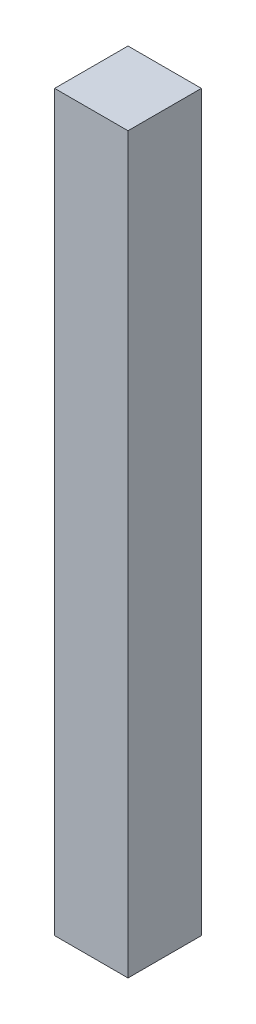
ISO-10303-21;
HEADER;
FILE_DESCRIPTION(('STEP AP214'),'2;1');
FILE_NAME('part.step','',(''),(''),'','','');
FILE_SCHEMA(('AUTOMOTIVE_DESIGN { 1 0 10303 214 1 1 1 1 }'));
ENDSEC;
DATA;
#1=APPLICATION_CONTEXT('core data for automotive mechanical design processes');
#2=APPLICATION_PROTOCOL_DEFINITION('international standard','automotive_design',2000,#1);
#3=PRODUCT_CONTEXT('',#1,'mechanical');
#4=PRODUCT('Part','Part','',(#3));
#5=PRODUCT_RELATED_PRODUCT_CATEGORY('part','',(#4));
#6=PRODUCT_DEFINITION_FORMATION('','',#4);
#7=PRODUCT_DEFINITION_CONTEXT('part definition',#1,'design');
#8=PRODUCT_DEFINITION('design','',#6,#7);
#9=PRODUCT_DEFINITION_SHAPE('','',#8);
#10=(LENGTH_UNIT() NAMED_UNIT(*) SI_UNIT(.MILLI.,.METRE.));
#11=(NAMED_UNIT(*) PLANE_ANGLE_UNIT() SI_UNIT($,.RADIAN.));
#12=(NAMED_UNIT(*) SI_UNIT($,.STERADIAN.) SOLID_ANGLE_UNIT());
#13=UNCERTAINTY_MEASURE_WITH_UNIT(LENGTH_MEASURE(1.E-05),#10,'distance_accuracy_value','');
#14=(GEOMETRIC_REPRESENTATION_CONTEXT(3) GLOBAL_UNCERTAINTY_ASSIGNED_CONTEXT((#13)) GLOBAL_UNIT_ASSIGNED_CONTEXT((#10,
#11,#12)) REPRESENTATION_CONTEXT('',''));
#15=CARTESIAN_POINT('',(0.,0.,0.));
#16=DIRECTION('',(0.,0.,1.));
#17=DIRECTION('',(1.,0.,0.));
#18=AXIS2_PLACEMENT_3D('',#15,#16,#17);
#19=CARTESIAN_POINT('',(0.,200.,0.));
#20=DIRECTION('',(1.,0.,0.));
#21=DIRECTION('',(0.,0.,-1.));
#22=AXIS2_PLACEMENT_3D('',#19,#20,#21);
#23=PLANE('',#22);
#24=DIRECTION('',(0.,0.,1.));
#25=VECTOR('',#24,1.);
#26=CARTESIAN_POINT('',(0.,0.,0.));
#27=LINE('',#26,#25);
#28=CARTESIAN_POINT('',(0.,0.,0.));
#29=VERTEX_POINT('',#28);
#30=CARTESIAN_POINT('',(0.,0.,20.));
#31=VERTEX_POINT('',#30);
#32=EDGE_CURVE('E98',#29,#31,#27,.T.);
#33=ORIENTED_EDGE('',*,*,#32,.T.);
#34=DIRECTION('',(0.,-1.,0.));
#35=VECTOR('',#34,1.);
#36=CARTESIAN_POINT('',(0.,200.,20.));
#37=LINE('',#36,#35);
#38=CARTESIAN_POINT('',(0.,200.,20.));
#39=VERTEX_POINT('',#38);
#40=EDGE_CURVE('E11',#39,#31,#37,.T.);
#41=ORIENTED_EDGE('',*,*,#40,.F.);
#42=DIRECTION('',(0.,0.,1.));
#43=VECTOR('',#42,1.);
#44=CARTESIAN_POINT('',(0.,200.,0.));
#45=LINE('',#44,#43);
#46=CARTESIAN_POINT('',(0.,200.,0.));
#47=VERTEX_POINT('',#46);
#48=EDGE_CURVE('E86',#47,#39,#45,.T.);
#49=ORIENTED_EDGE('',*,*,#48,.F.);
#50=DIRECTION('',(0.,-1.,0.));
#51=VECTOR('',#50,1.);
#52=CARTESIAN_POINT('',(0.,200.,0.));
#53=LINE('',#52,#51);
#54=EDGE_CURVE('E94',#47,#29,#53,.T.);
#55=ORIENTED_EDGE('',*,*,#54,.T.);
#56=EDGE_LOOP('',(#33,#41,#49,#55));
#57=FACE_BOUND('',#56,.T.);
#58=ADVANCED_FACE('F35',(#57),#23,.F.);
#59=CARTESIAN_POINT('',(0.,200.,20.));
#60=DIRECTION('',(0.,0.,-1.));
#61=DIRECTION('',(-1.,0.,0.));
#62=AXIS2_PLACEMENT_3D('',#59,#60,#61);
#63=PLANE('',#62);
#64=DIRECTION('',(1.,0.,0.));
#65=VECTOR('',#64,1.);
#66=CARTESIAN_POINT('',(0.,0.,20.));
#67=LINE('',#66,#65);
#68=CARTESIAN_POINT('',(20.,0.,20.));
#69=VERTEX_POINT('',#68);
#70=EDGE_CURVE('E90',#31,#69,#67,.T.);
#71=ORIENTED_EDGE('',*,*,#70,.T.);
#72=DIRECTION('',(0.,-1.,0.));
#73=VECTOR('',#72,1.);
#74=CARTESIAN_POINT('',(20.,200.,20.));
#75=LINE('',#74,#73);
#76=CARTESIAN_POINT('',(20.,200.,20.));
#77=VERTEX_POINT('',#76);
#78=EDGE_CURVE('E43',#77,#69,#75,.T.);
#79=ORIENTED_EDGE('',*,*,#78,.F.);
#80=DIRECTION('',(1.,0.,0.));
#81=VECTOR('',#80,1.);
#82=CARTESIAN_POINT('',(0.,200.,20.));
#83=LINE('',#82,#81);
#84=EDGE_CURVE('E81',#39,#77,#83,.T.);
#85=ORIENTED_EDGE('',*,*,#84,.F.);
#86=ORIENTED_EDGE('',*,*,#40,.T.);
#87=EDGE_LOOP('',(#71,#79,#85,#86));
#88=FACE_BOUND('',#87,.T.);
#89=ADVANCED_FACE('F89',(#88),#63,.F.);
#90=CARTESIAN_POINT('',(20.,200.,0.));
#91=DIRECTION('',(-1.,0.,0.));
#92=DIRECTION('',(0.,0.,1.));
#93=AXIS2_PLACEMENT_3D('',#90,#91,#92);
#94=PLANE('',#93);
#95=DIRECTION('',(0.,0.,-1.));
#96=VECTOR('',#95,1.);
#97=CARTESIAN_POINT('',(20.,0.,0.));
#98=LINE('',#97,#96);
#99=CARTESIAN_POINT('',(20.,0.,0.));
#100=VERTEX_POINT('',#99);
#101=EDGE_CURVE('E68',#69,#100,#98,.T.);
#102=ORIENTED_EDGE('',*,*,#101,.T.);
#103=DIRECTION('',(0.,-1.,0.));
#104=VECTOR('',#103,1.);
#105=CARTESIAN_POINT('',(20.,200.,0.));
#106=LINE('',#105,#104);
#107=CARTESIAN_POINT('',(20.,200.,0.));
#108=VERTEX_POINT('',#107);
#109=EDGE_CURVE('E91',#108,#100,#106,.T.);
#110=ORIENTED_EDGE('',*,*,#109,.F.);
#111=DIRECTION('',(0.,0.,-1.));
#112=VECTOR('',#111,1.);
#113=CARTESIAN_POINT('',(20.,200.,0.));
#114=LINE('',#113,#112);
#115=EDGE_CURVE('E84',#77,#108,#114,.T.);
#116=ORIENTED_EDGE('',*,*,#115,.F.);
#117=ORIENTED_EDGE('',*,*,#78,.T.);
#118=EDGE_LOOP('',(#102,#110,#116,#117));
#119=FACE_BOUND('',#118,.T.);
#120=ADVANCED_FACE('F92',(#119),#94,.F.);
#121=CARTESIAN_POINT('',(0.,200.,0.));
#122=DIRECTION('',(0.,0.,1.));
#123=DIRECTION('',(1.,0.,0.));
#124=AXIS2_PLACEMENT_3D('',#121,#122,#123);
#125=PLANE('',#124);
#126=DIRECTION('',(-1.,0.,0.));
#127=VECTOR('',#126,1.);
#128=CARTESIAN_POINT('',(0.,0.,0.));
#129=LINE('',#128,#127);
#130=EDGE_CURVE('E74',#100,#29,#129,.T.);
#131=ORIENTED_EDGE('',*,*,#130,.T.);
#132=ORIENTED_EDGE('',*,*,#54,.F.);
#133=DIRECTION('',(-1.,0.,0.));
#134=VECTOR('',#133,1.);
#135=CARTESIAN_POINT('',(0.,200.,0.));
#136=LINE('',#135,#134);
#137=EDGE_CURVE('E51',#108,#47,#136,.T.);
#138=ORIENTED_EDGE('',*,*,#137,.F.);
#139=ORIENTED_EDGE('',*,*,#109,.T.);
#140=EDGE_LOOP('',(#131,#132,#138,#139));
#141=FACE_BOUND('',#140,.T.);
#142=ADVANCED_FACE('F105',(#141),#125,.F.);
#143=CARTESIAN_POINT('',(0.,200.,0.));
#144=DIRECTION('',(0.,1.,0.));
#145=DIRECTION('',(0.,0.,1.));
#146=AXIS2_PLACEMENT_3D('',#143,#144,#145);
#147=PLANE('',#146);
#148=ORIENTED_EDGE('',*,*,#48,.T.);
#149=ORIENTED_EDGE('',*,*,#84,.T.);
#150=ORIENTED_EDGE('',*,*,#115,.T.);
#151=ORIENTED_EDGE('',*,*,#137,.T.);
#152=EDGE_LOOP('',(#148,#149,#150,#151));
#153=FACE_BOUND('',#152,.T.);
#154=ADVANCED_FACE('F82',(#153),#147,.T.);
#155=CARTESIAN_POINT('',(0.,0.,0.));
#156=DIRECTION('',(0.,1.,0.));
#157=DIRECTION('',(0.,0.,1.));
#158=AXIS2_PLACEMENT_3D('',#155,#156,#157);
#159=PLANE('',#158);
#160=ORIENTED_EDGE('',*,*,#32,.F.);
#161=ORIENTED_EDGE('',*,*,#130,.F.);
#162=ORIENTED_EDGE('',*,*,#101,.F.);
#163=ORIENTED_EDGE('',*,*,#70,.F.);
#164=EDGE_LOOP('',(#160,#161,#162,#163));
#165=FACE_BOUND('',#164,.T.);
#166=ADVANCED_FACE('F108',(#165),#159,.F.);
#167=CLOSED_SHELL('',(#58,#89,#120,#142,#154,#166));
#168=MANIFOLD_SOLID_BREP('B2',#167);
#169=ADVANCED_BREP_SHAPE_REPRESENTATION('',(#18,#168),#14);
#170=SHAPE_DEFINITION_REPRESENTATION(#9,#169);
ENDSEC;
END-ISO-10303-21;
